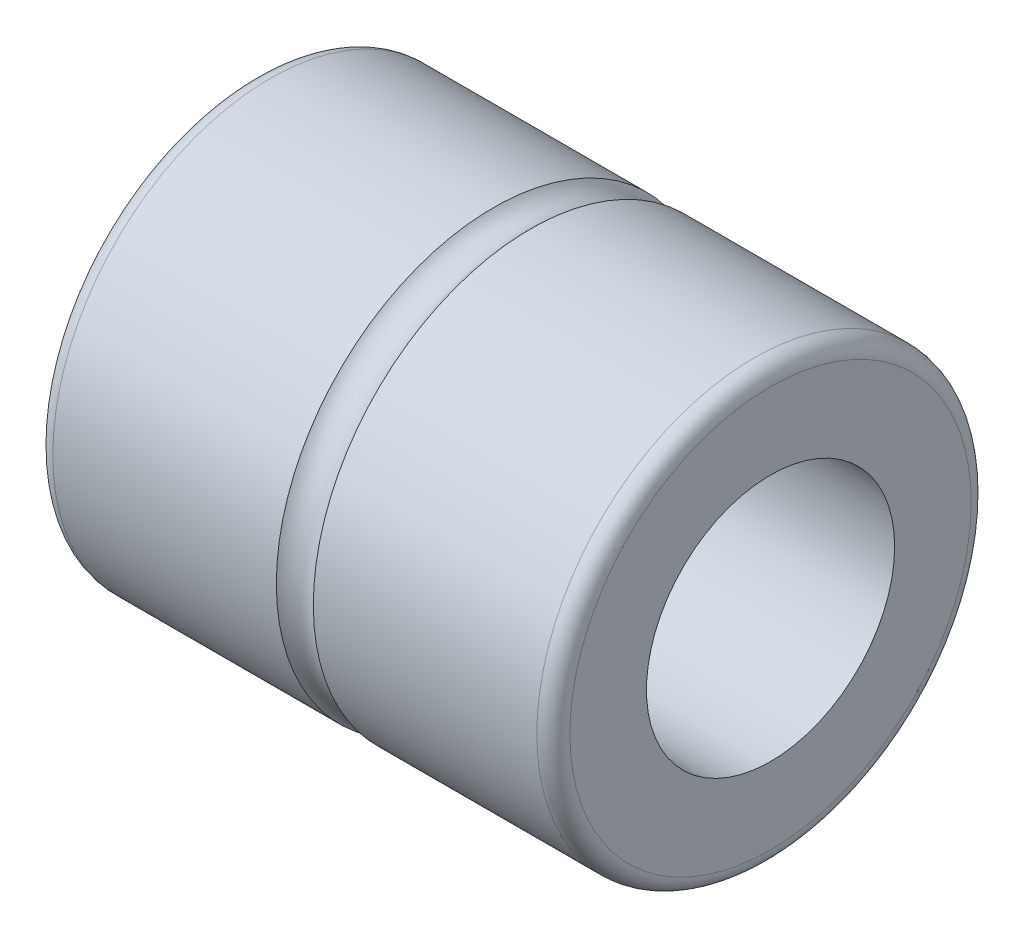
ISO-10303-21;
HEADER;
FILE_DESCRIPTION(('STEP AP214'),'2;1');
FILE_NAME('part.step','',(''),(''),'','','');
FILE_SCHEMA(('AUTOMOTIVE_DESIGN { 1 0 10303 214 1 1 1 1 }'));
ENDSEC;
DATA;
#1=APPLICATION_CONTEXT('core data for automotive mechanical design processes');
#2=APPLICATION_PROTOCOL_DEFINITION('international standard','automotive_design',2000,#1);
#3=PRODUCT_CONTEXT('',#1,'mechanical');
#4=PRODUCT('Part','Part','',(#3));
#5=PRODUCT_RELATED_PRODUCT_CATEGORY('part','',(#4));
#6=PRODUCT_DEFINITION_FORMATION('','',#4);
#7=PRODUCT_DEFINITION_CONTEXT('part definition',#1,'design');
#8=PRODUCT_DEFINITION('design','',#6,#7);
#9=PRODUCT_DEFINITION_SHAPE('','',#8);
#10=(LENGTH_UNIT() NAMED_UNIT(*) SI_UNIT(.MILLI.,.METRE.));
#11=(NAMED_UNIT(*) PLANE_ANGLE_UNIT() SI_UNIT($,.RADIAN.));
#12=(NAMED_UNIT(*) SI_UNIT($,.STERADIAN.) SOLID_ANGLE_UNIT());
#13=UNCERTAINTY_MEASURE_WITH_UNIT(LENGTH_MEASURE(1.E-05),#10,'distance_accuracy_value','');
#14=(GEOMETRIC_REPRESENTATION_CONTEXT(3) GLOBAL_UNCERTAINTY_ASSIGNED_CONTEXT((#13)) GLOBAL_UNIT_ASSIGNED_CONTEXT((#10,
#11,#12)) REPRESENTATION_CONTEXT('',''));
#15=CARTESIAN_POINT('',(0.,0.,0.));
#16=DIRECTION('',(0.,0.,1.));
#17=DIRECTION('',(1.,0.,0.));
#18=AXIS2_PLACEMENT_3D('',#15,#16,#17);
#19=CARTESIAN_POINT('',(12.5,0.,0.));
#20=DIRECTION('',(-1.,0.,0.));
#21=DIRECTION('',(0.,0.,1.));
#22=AXIS2_PLACEMENT_3D('',#19,#20,#21);
#23=TOROIDAL_SURFACE('',#22,11.3,1.2);
#24=CARTESIAN_POINT('',(13.3944271909999,0.,0.));
#25=DIRECTION('',(1.,0.,0.));
#26=DIRECTION('',(0.,0.,-1.));
#27=AXIS2_PLACEMENT_3D('',#24,#25,#26);
#28=CIRCLE('',#27,10.5);
#29=CARTESIAN_POINT('',(13.3944271909999,0.,-10.5));
#30=VERTEX_POINT('',#29);
#31=EDGE_CURVE('E197',#30,#30,#28,.T.);
#32=ORIENTED_EDGE('',*,*,#31,.F.);
#33=EDGE_LOOP('',(#32));
#34=FACE_BOUND('',#33,.T.);
#35=CARTESIAN_POINT('',(11.6055728090001,0.,0.));
#36=DIRECTION('',(1.,0.,0.));
#37=DIRECTION('',(0.,0.,-1.));
#38=AXIS2_PLACEMENT_3D('',#35,#36,#37);
#39=CIRCLE('',#38,10.5);
#40=CARTESIAN_POINT('',(11.6055728090001,0.,-10.5));
#41=VERTEX_POINT('',#40);
#42=EDGE_CURVE('E190',#41,#41,#39,.F.);
#43=ORIENTED_EDGE('',*,*,#42,.F.);
#44=EDGE_LOOP('',(#43));
#45=FACE_BOUND('',#44,.T.);
#46=ADVANCED_FACE('F16',(#34,#45),#23,.F.);
#47=CARTESIAN_POINT('',(18.7972135955,0.,0.));
#48=DIRECTION('',(1.,0.,0.));
#49=DIRECTION('',(0.,0.,-1.));
#50=AXIS2_PLACEMENT_3D('',#47,#48,#49);
#51=CYLINDRICAL_SURFACE('',#50,10.5);
#52=CARTESIAN_POINT('',(24.2,0.,0.));
#53=DIRECTION('',(-1.,0.,0.));
#54=DIRECTION('',(0.,0.,1.));
#55=AXIS2_PLACEMENT_3D('',#52,#53,#54);
#56=CIRCLE('',#55,10.5);
#57=CARTESIAN_POINT('',(24.2,0.,10.5));
#58=VERTEX_POINT('',#57);
#59=EDGE_CURVE('E186',#58,#58,#56,.F.);
#60=ORIENTED_EDGE('',*,*,#59,.F.);
#61=EDGE_LOOP('',(#60));
#62=FACE_BOUND('',#61,.T.);
#63=ORIENTED_EDGE('',*,*,#31,.T.);
#64=EDGE_LOOP('',(#63));
#65=FACE_BOUND('',#64,.T.);
#66=ADVANCED_FACE('F202',(#62,#65),#51,.T.);
#67=CARTESIAN_POINT('',(6.20278640450004,0.,0.));
#68=DIRECTION('',(1.,0.,0.));
#69=DIRECTION('',(0.,0.,-1.));
#70=AXIS2_PLACEMENT_3D('',#67,#68,#69);
#71=CYLINDRICAL_SURFACE('',#70,10.5);
#72=ORIENTED_EDGE('',*,*,#42,.T.);
#73=EDGE_LOOP('',(#72));
#74=FACE_BOUND('',#73,.T.);
#75=CARTESIAN_POINT('',(0.800000000000001,0.,0.));
#76=DIRECTION('',(-1.,0.,0.));
#77=DIRECTION('',(0.,0.,1.));
#78=AXIS2_PLACEMENT_3D('',#75,#76,#77);
#79=CIRCLE('',#78,10.5);
#80=CARTESIAN_POINT('',(0.800000000000001,0.,10.5));
#81=VERTEX_POINT('',#80);
#82=EDGE_CURVE('E184',#81,#81,#79,.T.);
#83=ORIENTED_EDGE('',*,*,#82,.F.);
#84=EDGE_LOOP('',(#83));
#85=FACE_BOUND('',#84,.T.);
#86=ADVANCED_FACE('F208',(#74,#85),#71,.T.);
#87=CARTESIAN_POINT('',(24.2,0.,0.));
#88=DIRECTION('',(-1.,0.,0.));
#89=DIRECTION('',(0.,0.,1.));
#90=AXIS2_PLACEMENT_3D('',#87,#88,#89);
#91=TOROIDAL_SURFACE('',#90,9.7,0.800000000000002);
#92=ORIENTED_EDGE('',*,*,#59,.T.);
#93=EDGE_LOOP('',(#92));
#94=FACE_BOUND('',#93,.T.);
#95=CARTESIAN_POINT('',(25.,0.,0.));
#96=DIRECTION('',(-1.,0.,0.));
#97=DIRECTION('',(0.,0.,-1.));
#98=AXIS2_PLACEMENT_3D('',#95,#96,#97);
#99=CIRCLE('',#98,9.7);
#100=CARTESIAN_POINT('',(25.,0.,9.7));
#101=VERTEX_POINT('',#100);
#102=CARTESIAN_POINT('',(25.,0.,-9.7));
#103=VERTEX_POINT('',#102);
#104=EDGE_CURVE('E50',#101,#103,#99,.F.);
#105=ORIENTED_EDGE('',*,*,#104,.F.);
#106=CARTESIAN_POINT('',(25.,0.,0.));
#107=DIRECTION('',(-1.,0.,0.));
#108=DIRECTION('',(0.,0.,1.));
#109=AXIS2_PLACEMENT_3D('',#106,#107,#108);
#110=CIRCLE('',#109,9.7);
#111=CARTESIAN_POINT('',(25.,9.7,0.));
#112=VERTEX_POINT('',#111);
#113=EDGE_CURVE('E118',#112,#101,#110,.F.);
#114=ORIENTED_EDGE('',*,*,#113,.F.);
#115=CARTESIAN_POINT('',(25.,0.,0.));
#116=DIRECTION('',(-1.,0.,0.));
#117=DIRECTION('',(0.,1.,0.));
#118=AXIS2_PLACEMENT_3D('',#115,#116,#117);
#119=CIRCLE('',#118,9.7);
#120=EDGE_CURVE('E53',#103,#112,#119,.F.);
#121=ORIENTED_EDGE('',*,*,#120,.F.);
#122=EDGE_LOOP('',(#105,#114,#121));
#123=FACE_BOUND('',#122,.T.);
#124=ADVANCED_FACE('F91',(#94,#123),#91,.T.);
#125=CARTESIAN_POINT('',(0.800000000000001,0.,0.));
#126=DIRECTION('',(-1.,0.,0.));
#127=DIRECTION('',(0.,0.,1.));
#128=AXIS2_PLACEMENT_3D('',#125,#126,#127);
#129=TOROIDAL_SURFACE('',#128,9.7,0.800000000000001);
#130=ORIENTED_EDGE('',*,*,#82,.T.);
#131=EDGE_LOOP('',(#130));
#132=FACE_BOUND('',#131,.T.);
#133=CARTESIAN_POINT('',(0.,0.,0.));
#134=DIRECTION('',(1.,0.,0.));
#135=DIRECTION('',(0.,0.,-1.));
#136=AXIS2_PLACEMENT_3D('',#133,#134,#135);
#137=CIRCLE('',#136,9.7);
#138=CARTESIAN_POINT('',(0.,9.7,0.));
#139=VERTEX_POINT('',#138);
#140=CARTESIAN_POINT('',(0.,0.,-9.7));
#141=VERTEX_POINT('',#140);
#142=EDGE_CURVE('E62',#139,#141,#137,.F.);
#143=ORIENTED_EDGE('',*,*,#142,.F.);
#144=CARTESIAN_POINT('',(0.,0.,0.));
#145=DIRECTION('',(1.,0.,0.));
#146=DIRECTION('',(0.,1.,0.));
#147=AXIS2_PLACEMENT_3D('',#144,#145,#146);
#148=CIRCLE('',#147,9.7);
#149=CARTESIAN_POINT('',(0.,0.,9.7));
#150=VERTEX_POINT('',#149);
#151=EDGE_CURVE('E57',#150,#139,#148,.F.);
#152=ORIENTED_EDGE('',*,*,#151,.F.);
#153=CARTESIAN_POINT('',(0.,0.,0.));
#154=DIRECTION('',(1.,0.,0.));
#155=DIRECTION('',(0.,0.,1.));
#156=AXIS2_PLACEMENT_3D('',#153,#154,#155);
#157=CIRCLE('',#156,9.7);
#158=EDGE_CURVE('E37',#141,#150,#157,.F.);
#159=ORIENTED_EDGE('',*,*,#158,.F.);
#160=EDGE_LOOP('',(#143,#152,#159));
#161=FACE_BOUND('',#160,.T.);
#162=ADVANCED_FACE('F69',(#132,#161),#129,.T.);
#163=CARTESIAN_POINT('',(25.,4.85,0.));
#164=DIRECTION('',(1.,0.,0.));
#165=DIRECTION('',(0.,0.,-1.));
#166=AXIS2_PLACEMENT_3D('',#163,#164,#165);
#167=PLANE('',#166);
#168=ORIENTED_EDGE('',*,*,#113,.T.);
#169=ORIENTED_EDGE('',*,*,#104,.T.);
#170=ORIENTED_EDGE('',*,*,#120,.T.);
#171=EDGE_LOOP('',(#168,#169,#170));
#172=FACE_BOUND('',#171,.T.);
#173=CARTESIAN_POINT('',(25.,0.,0.));
#174=DIRECTION('',(1.,0.,0.));
#175=DIRECTION('',(0.,0.,-1.));
#176=AXIS2_PLACEMENT_3D('',#173,#174,#175);
#177=CIRCLE('',#176,6.);
#178=CARTESIAN_POINT('',(25.,0.,-6.));
#179=VERTEX_POINT('',#178);
#180=EDGE_CURVE('E28',#179,#179,#177,.F.);
#181=ORIENTED_EDGE('',*,*,#180,.T.);
#182=EDGE_LOOP('',(#181));
#183=FACE_BOUND('',#182,.T.);
#184=ADVANCED_FACE('F90',(#172,#183),#167,.T.);
#185=CARTESIAN_POINT('',(0.,4.85,0.));
#186=DIRECTION('',(-1.,0.,0.));
#187=DIRECTION('',(0.,0.,1.));
#188=AXIS2_PLACEMENT_3D('',#185,#186,#187);
#189=PLANE('',#188);
#190=ORIENTED_EDGE('',*,*,#158,.T.);
#191=ORIENTED_EDGE('',*,*,#151,.T.);
#192=ORIENTED_EDGE('',*,*,#142,.T.);
#193=EDGE_LOOP('',(#190,#191,#192));
#194=FACE_BOUND('',#193,.T.);
#195=CARTESIAN_POINT('',(0.,0.,0.));
#196=DIRECTION('',(1.,0.,0.));
#197=DIRECTION('',(0.,0.,-1.));
#198=AXIS2_PLACEMENT_3D('',#195,#196,#197);
#199=CIRCLE('',#198,6.);
#200=CARTESIAN_POINT('',(0.,0.,-6.));
#201=VERTEX_POINT('',#200);
#202=EDGE_CURVE('E11',#201,#201,#199,.T.);
#203=ORIENTED_EDGE('',*,*,#202,.T.);
#204=EDGE_LOOP('',(#203));
#205=FACE_BOUND('',#204,.T.);
#206=ADVANCED_FACE('F60',(#194,#205),#189,.T.);
#207=CARTESIAN_POINT('',(12.5,0.,0.));
#208=DIRECTION('',(1.,0.,0.));
#209=DIRECTION('',(0.,0.,-1.));
#210=AXIS2_PLACEMENT_3D('',#207,#208,#209);
#211=CYLINDRICAL_SURFACE('',#210,6.);
#212=ORIENTED_EDGE('',*,*,#202,.F.);
#213=EDGE_LOOP('',(#212));
#214=FACE_BOUND('',#213,.T.);
#215=ORIENTED_EDGE('',*,*,#180,.F.);
#216=EDGE_LOOP('',(#215));
#217=FACE_BOUND('',#216,.T.);
#218=ADVANCED_FACE('F136',(#214,#217),#211,.F.);
#219=CLOSED_SHELL('',(#46,#66,#86,#124,#162,#184,#206,#218));
#220=MANIFOLD_SOLID_BREP('B1',#219);
#221=ADVANCED_BREP_SHAPE_REPRESENTATION('',(#18,#220),#14);
#222=SHAPE_DEFINITION_REPRESENTATION(#9,#221);
ENDSEC;
END-ISO-10303-21;
